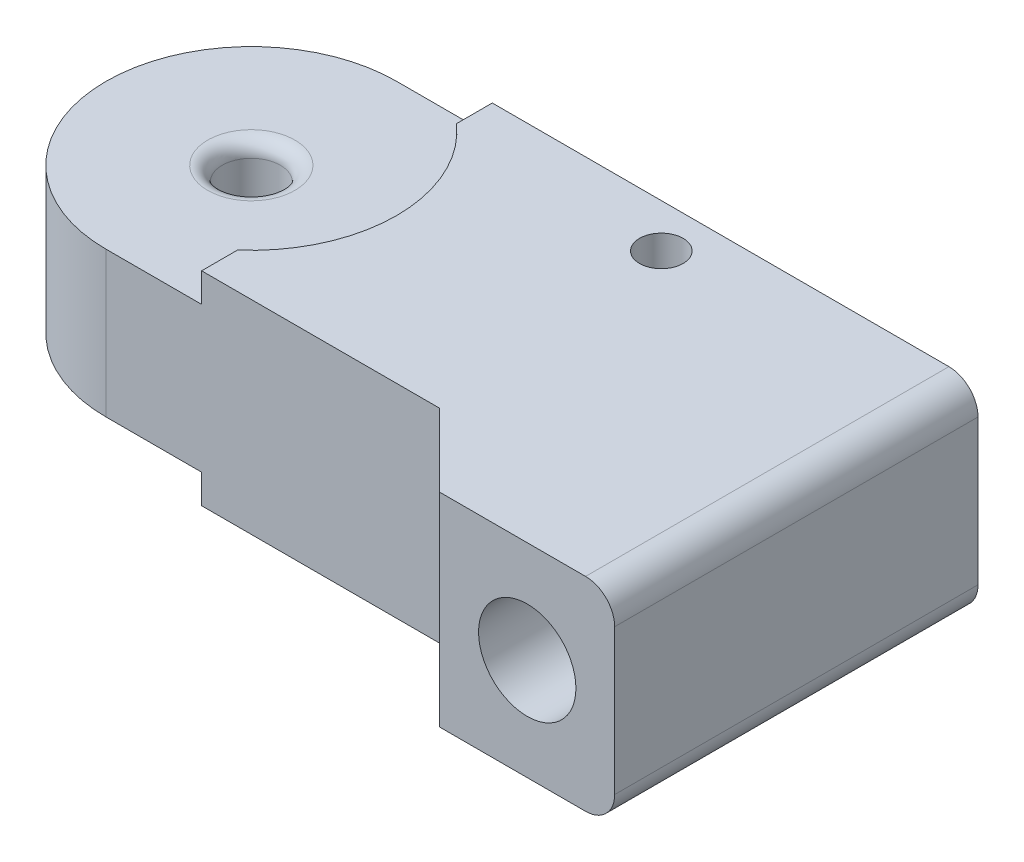
ISO-10303-21;
HEADER;
FILE_DESCRIPTION(('STEP AP214'),'2;1');
FILE_NAME('part.step','',(''),(''),'','','');
FILE_SCHEMA(('AUTOMOTIVE_DESIGN { 1 0 10303 214 1 1 1 1 }'));
ENDSEC;
DATA;
#1=APPLICATION_CONTEXT('core data for automotive mechanical design processes');
#2=APPLICATION_PROTOCOL_DEFINITION('international standard','automotive_design',2000,#1);
#3=PRODUCT_CONTEXT('',#1,'mechanical');
#4=PRODUCT('Part','Part','',(#3));
#5=PRODUCT_RELATED_PRODUCT_CATEGORY('part','',(#4));
#6=PRODUCT_DEFINITION_FORMATION('','',#4);
#7=PRODUCT_DEFINITION_CONTEXT('part definition',#1,'design');
#8=PRODUCT_DEFINITION('design','',#6,#7);
#9=PRODUCT_DEFINITION_SHAPE('','',#8);
#10=(LENGTH_UNIT() NAMED_UNIT(*) SI_UNIT(.MILLI.,.METRE.));
#11=(NAMED_UNIT(*) PLANE_ANGLE_UNIT() SI_UNIT($,.RADIAN.));
#12=(NAMED_UNIT(*) SI_UNIT($,.STERADIAN.) SOLID_ANGLE_UNIT());
#13=UNCERTAINTY_MEASURE_WITH_UNIT(LENGTH_MEASURE(1.E-05),#10,'distance_accuracy_value','');
#14=(GEOMETRIC_REPRESENTATION_CONTEXT(3) GLOBAL_UNCERTAINTY_ASSIGNED_CONTEXT((#13)) GLOBAL_UNIT_ASSIGNED_CONTEXT((#10,
#11,#12)) REPRESENTATION_CONTEXT('',''));
#15=CARTESIAN_POINT('',(0.,0.,0.));
#16=DIRECTION('',(0.,0.,1.));
#17=DIRECTION('',(1.,0.,0.));
#18=AXIS2_PLACEMENT_3D('',#15,#16,#17);
#19=CARTESIAN_POINT('',(25.,10.,10.));
#20=DIRECTION('',(0.,0.,-1.));
#21=DIRECTION('',(-1.,0.,0.));
#22=AXIS2_PLACEMENT_3D('',#19,#20,#21);
#23=PLANE('',#22);
#24=DIRECTION('',(1.,0.,0.));
#25=VECTOR('',#24,1.);
#26=CARTESIAN_POINT('',(25.,-2.,10.));
#27=LINE('',#26,#25);
#28=CARTESIAN_POINT('',(-8.42023376202405,-2.,10.));
#29=VERTEX_POINT('',#28);
#30=CARTESIAN_POINT('',(7.96424775126987,-2.,10.));
#31=VERTEX_POINT('',#30);
#32=EDGE_CURVE('E201',#29,#31,#27,.T.);
#33=ORIENTED_EDGE('',*,*,#32,.T.);
#34=DIRECTION('',(0.,1.,0.));
#35=VECTOR('',#34,1.);
#36=CARTESIAN_POINT('',(7.96424775126987,12.,10.));
#37=LINE('',#36,#35);
#38=CARTESIAN_POINT('',(7.96424775126987,12.,10.));
#39=VERTEX_POINT('',#38);
#40=EDGE_CURVE('E58',#31,#39,#37,.T.);
#41=ORIENTED_EDGE('',*,*,#40,.T.);
#42=DIRECTION('',(1.,0.,0.));
#43=VECTOR('',#42,1.);
#44=CARTESIAN_POINT('',(25.,12.,10.));
#45=LINE('',#44,#43);
#46=CARTESIAN_POINT('',(-8.42023376202405,12.,10.));
#47=VERTEX_POINT('',#46);
#48=EDGE_CURVE('E241',#47,#39,#45,.T.);
#49=ORIENTED_EDGE('',*,*,#48,.F.);
#50=DIRECTION('',(0.,-1.,0.));
#51=VECTOR('',#50,1.);
#52=CARTESIAN_POINT('',(-8.42023376202405,12.,10.));
#53=LINE('',#52,#51);
#54=CARTESIAN_POINT('',(-8.42023376202405,10.,10.));
#55=VERTEX_POINT('',#54);
#56=EDGE_CURVE('E243',#47,#55,#53,.T.);
#57=ORIENTED_EDGE('',*,*,#56,.T.);
#58=DIRECTION('',(1.,0.,0.));
#59=VECTOR('',#58,1.);
#60=CARTESIAN_POINT('',(25.,10.,10.));
#61=LINE('',#60,#59);
#62=CARTESIAN_POINT('',(-15.,10.,10.));
#63=VERTEX_POINT('',#62);
#64=EDGE_CURVE('E266',#63,#55,#61,.T.);
#65=ORIENTED_EDGE('',*,*,#64,.F.);
#66=DIRECTION('',(0.,-1.,0.));
#67=VECTOR('',#66,1.);
#68=CARTESIAN_POINT('',(-15.,10.,10.));
#69=LINE('',#68,#67);
#70=CARTESIAN_POINT('',(-15.,0.,10.));
#71=VERTEX_POINT('',#70);
#72=EDGE_CURVE('E277',#63,#71,#69,.T.);
#73=ORIENTED_EDGE('',*,*,#72,.T.);
#74=DIRECTION('',(1.,0.,0.));
#75=VECTOR('',#74,1.);
#76=CARTESIAN_POINT('',(25.,0.,10.));
#77=LINE('',#76,#75);
#78=CARTESIAN_POINT('',(-8.42023376202405,0.,10.));
#79=VERTEX_POINT('',#78);
#80=EDGE_CURVE('E272',#71,#79,#77,.T.);
#81=ORIENTED_EDGE('',*,*,#80,.T.);
#82=DIRECTION('',(0.,1.,0.));
#83=VECTOR('',#82,1.);
#84=CARTESIAN_POINT('',(-8.42023376202405,-2.,10.));
#85=LINE('',#84,#83);
#86=EDGE_CURVE('E226',#29,#79,#85,.T.);
#87=ORIENTED_EDGE('',*,*,#86,.F.);
#88=EDGE_LOOP('',(#33,#41,#49,#57,#65,#73,#81,#87));
#89=FACE_BOUND('',#88,.T.);
#90=ADVANCED_FACE('F36',(#89),#23,.F.);
#91=CARTESIAN_POINT('',(25.,10.,10.));
#92=DIRECTION('',(-1.,0.,0.));
#93=DIRECTION('',(0.,0.,1.));
#94=AXIS2_PLACEMENT_3D('',#91,#92,#93);
#95=PLANE('',#94);
#96=DIRECTION('',(0.,0.,-1.));
#97=VECTOR('',#96,1.);
#98=CARTESIAN_POINT('',(25.,10.,10.));
#99=LINE('',#98,#97);
#100=CARTESIAN_POINT('',(25.,10.,-10.));
#101=VERTEX_POINT('',#100);
#102=CARTESIAN_POINT('',(25.,10.,15.));
#103=VERTEX_POINT('',#102);
#104=EDGE_CURVE('E167',#101,#103,#99,.F.);
#105=ORIENTED_EDGE('',*,*,#104,.T.);
#106=DIRECTION('',(0.,1.,0.));
#107=VECTOR('',#106,1.);
#108=CARTESIAN_POINT('',(25.,0.,15.));
#109=LINE('',#108,#107);
#110=CARTESIAN_POINT('',(25.,0.,15.));
#111=VERTEX_POINT('',#110);
#112=EDGE_CURVE('E170',#111,#103,#109,.T.);
#113=ORIENTED_EDGE('',*,*,#112,.F.);
#114=DIRECTION('',(0.,0.,-1.));
#115=VECTOR('',#114,1.);
#116=CARTESIAN_POINT('',(25.,0.,-10.));
#117=LINE('',#116,#115);
#118=CARTESIAN_POINT('',(25.,0.,-10.));
#119=VERTEX_POINT('',#118);
#120=EDGE_CURVE('E156',#111,#119,#117,.T.);
#121=ORIENTED_EDGE('',*,*,#120,.T.);
#122=DIRECTION('',(0.,-1.,0.));
#123=VECTOR('',#122,1.);
#124=CARTESIAN_POINT('',(25.,10.,-10.));
#125=LINE('',#124,#123);
#126=EDGE_CURVE('E271',#101,#119,#125,.T.);
#127=ORIENTED_EDGE('',*,*,#126,.F.);
#128=EDGE_LOOP('',(#105,#113,#121,#127));
#129=FACE_BOUND('',#128,.T.);
#130=ADVANCED_FACE('F171',(#129),#95,.F.);
#131=CARTESIAN_POINT('',(25.,10.,-10.));
#132=DIRECTION('',(0.,0.,1.));
#133=DIRECTION('',(1.,0.,0.));
#134=AXIS2_PLACEMENT_3D('',#131,#132,#133);
#135=PLANE('',#134);
#136=CARTESIAN_POINT('',(18.9842477512698,5.,-10.));
#137=DIRECTION('',(0.,0.,-1.));
#138=DIRECTION('',(-1.,0.,0.));
#139=AXIS2_PLACEMENT_3D('',#136,#137,#138);
#140=CIRCLE('',#139,3.35);
#141=CARTESIAN_POINT('',(15.6342477512698,5.,-10.));
#142=VERTEX_POINT('',#141);
#143=EDGE_CURVE('E262',#142,#142,#140,.T.);
#144=ORIENTED_EDGE('',*,*,#143,.F.);
#145=EDGE_LOOP('',(#144));
#146=FACE_BOUND('',#145,.T.);
#147=ORIENTED_EDGE('',*,*,#126,.T.);
#148=CARTESIAN_POINT('',(23.,0.,-10.));
#149=DIRECTION('',(0.,0.,1.));
#150=DIRECTION('',(1.,0.,0.));
#151=AXIS2_PLACEMENT_3D('',#148,#149,#150);
#152=CIRCLE('',#151,2.);
#153=CARTESIAN_POINT('',(23.,-2.,-10.));
#154=VERTEX_POINT('',#153);
#155=EDGE_CURVE('E162',#119,#154,#152,.F.);
#156=ORIENTED_EDGE('',*,*,#155,.T.);
#157=DIRECTION('',(-1.,0.,0.));
#158=VECTOR('',#157,1.);
#159=CARTESIAN_POINT('',(25.,-2.,-10.));
#160=LINE('',#159,#158);
#161=CARTESIAN_POINT('',(-8.42023376202405,-2.,-10.));
#162=VERTEX_POINT('',#161);
#163=EDGE_CURVE('E199',#154,#162,#160,.T.);
#164=ORIENTED_EDGE('',*,*,#163,.T.);
#165=DIRECTION('',(0.,1.,0.));
#166=VECTOR('',#165,1.);
#167=CARTESIAN_POINT('',(-8.42023376202405,-2.,-10.));
#168=LINE('',#167,#166);
#169=CARTESIAN_POINT('',(-8.42023376202405,0.,-10.));
#170=VERTEX_POINT('',#169);
#171=EDGE_CURVE('E213',#162,#170,#168,.T.);
#172=ORIENTED_EDGE('',*,*,#171,.T.);
#173=DIRECTION('',(-1.,0.,0.));
#174=VECTOR('',#173,1.);
#175=CARTESIAN_POINT('',(25.,0.,-10.));
#176=LINE('',#175,#174);
#177=CARTESIAN_POINT('',(-15.,0.,-10.));
#178=VERTEX_POINT('',#177);
#179=EDGE_CURVE('E269',#170,#178,#176,.T.);
#180=ORIENTED_EDGE('',*,*,#179,.T.);
#181=DIRECTION('',(0.,-1.,0.));
#182=VECTOR('',#181,1.);
#183=CARTESIAN_POINT('',(-15.,10.,-10.));
#184=LINE('',#183,#182);
#185=CARTESIAN_POINT('',(-15.,10.,-10.));
#186=VERTEX_POINT('',#185);
#187=EDGE_CURVE('E289',#178,#186,#184,.F.);
#188=ORIENTED_EDGE('',*,*,#187,.T.);
#189=DIRECTION('',(-1.,0.,0.));
#190=VECTOR('',#189,1.);
#191=CARTESIAN_POINT('',(25.,10.,-10.));
#192=LINE('',#191,#190);
#193=CARTESIAN_POINT('',(-8.42023376202405,10.,-10.));
#194=VERTEX_POINT('',#193);
#195=EDGE_CURVE('E268',#194,#186,#192,.T.);
#196=ORIENTED_EDGE('',*,*,#195,.F.);
#197=DIRECTION('',(0.,-1.,0.));
#198=VECTOR('',#197,1.);
#199=CARTESIAN_POINT('',(-8.42023376202405,12.,-10.));
#200=LINE('',#199,#198);
#201=CARTESIAN_POINT('',(-8.42023376202405,12.,-10.));
#202=VERTEX_POINT('',#201);
#203=EDGE_CURVE('E259',#202,#194,#200,.T.);
#204=ORIENTED_EDGE('',*,*,#203,.F.);
#205=DIRECTION('',(-1.,0.,0.));
#206=VECTOR('',#205,1.);
#207=CARTESIAN_POINT('',(25.,12.,-10.));
#208=LINE('',#207,#206);
#209=CARTESIAN_POINT('',(23.,12.,-10.));
#210=VERTEX_POINT('',#209);
#211=EDGE_CURVE('E232',#210,#202,#208,.T.);
#212=ORIENTED_EDGE('',*,*,#211,.F.);
#213=CARTESIAN_POINT('',(23.,10.,-10.));
#214=DIRECTION('',(0.,0.,1.));
#215=DIRECTION('',(1.,0.,0.));
#216=AXIS2_PLACEMENT_3D('',#213,#214,#215);
#217=CIRCLE('',#216,2.);
#218=EDGE_CURVE('E166',#210,#101,#217,.F.);
#219=ORIENTED_EDGE('',*,*,#218,.T.);
#220=EDGE_LOOP('',(#147,#156,#164,#172,#180,#188,#196,#204,#212,#219));
#221=FACE_BOUND('',#220,.T.);
#222=ADVANCED_FACE('F337',(#146,#221),#135,.F.);
#223=CARTESIAN_POINT('',(0.,10.,0.));
#224=DIRECTION('',(0.,1.,0.));
#225=DIRECTION('',(0.,0.,1.));
#226=AXIS2_PLACEMENT_3D('',#223,#224,#225);
#227=PLANE('',#226);
#228=CARTESIAN_POINT('',(-15.,10.,0.));
#229=DIRECTION('',(0.,1.,0.));
#230=DIRECTION('',(0.,0.,1.));
#231=AXIS2_PLACEMENT_3D('',#228,#229,#230);
#232=CIRCLE('',#231,3.);
#233=CARTESIAN_POINT('',(-15.,10.,3.));
#234=VERTEX_POINT('',#233);
#235=EDGE_CURVE('E308',#234,#234,#232,.F.);
#236=ORIENTED_EDGE('',*,*,#235,.T.);
#237=EDGE_LOOP('',(#236));
#238=FACE_BOUND('',#237,.T.);
#239=DIRECTION('',(0.,0.,1.));
#240=VECTOR('',#239,1.);
#241=CARTESIAN_POINT('',(-8.42023376202405,10.,7.53038353960751));
#242=LINE('',#241,#240);
#243=CARTESIAN_POINT('',(-8.42023376202405,10.,7.53038353960751));
#244=VERTEX_POINT('',#243);
#245=EDGE_CURVE('E235',#244,#55,#242,.T.);
#246=ORIENTED_EDGE('',*,*,#245,.F.);
#247=CARTESIAN_POINT('',(-15.,10.,0.));
#248=DIRECTION('',(0.,-1.,0.));
#249=DIRECTION('',(0.,0.,1.));
#250=AXIS2_PLACEMENT_3D('',#247,#248,#249);
#251=CIRCLE('',#250,10.);
#252=CARTESIAN_POINT('',(-8.42023376202405,10.,-7.53038353960751));
#253=VERTEX_POINT('',#252);
#254=EDGE_CURVE('E246',#253,#244,#251,.T.);
#255=ORIENTED_EDGE('',*,*,#254,.F.);
#256=DIRECTION('',(0.,0.,1.));
#257=VECTOR('',#256,1.);
#258=CARTESIAN_POINT('',(-8.42023376202405,10.,-10.));
#259=LINE('',#258,#257);
#260=EDGE_CURVE('E231',#194,#253,#259,.T.);
#261=ORIENTED_EDGE('',*,*,#260,.F.);
#262=ORIENTED_EDGE('',*,*,#195,.T.);
#263=CARTESIAN_POINT('',(-15.,10.,0.));
#264=DIRECTION('',(0.,1.,0.));
#265=DIRECTION('',(0.,0.,1.));
#266=AXIS2_PLACEMENT_3D('',#263,#264,#265);
#267=CIRCLE('',#266,10.);
#268=CARTESIAN_POINT('',(-25.,10.,0.));
#269=VERTEX_POINT('',#268);
#270=EDGE_CURVE('E285',#186,#269,#267,.T.);
#271=ORIENTED_EDGE('',*,*,#270,.T.);
#272=CARTESIAN_POINT('',(-15.,10.,0.));
#273=DIRECTION('',(0.,1.,0.));
#274=DIRECTION('',(0.,0.,1.));
#275=AXIS2_PLACEMENT_3D('',#272,#273,#274);
#276=CIRCLE('',#275,10.);
#277=EDGE_CURVE('E287',#269,#63,#276,.T.);
#278=ORIENTED_EDGE('',*,*,#277,.T.);
#279=ORIENTED_EDGE('',*,*,#64,.T.);
#280=EDGE_LOOP('',(#246,#255,#261,#262,#271,#278,#279));
#281=FACE_BOUND('',#280,.T.);
#282=ADVANCED_FACE('F383',(#238,#281),#227,.T.);
#283=CARTESIAN_POINT('',(0.,0.,0.));
#284=DIRECTION('',(0.,1.,0.));
#285=DIRECTION('',(0.,0.,1.));
#286=AXIS2_PLACEMENT_3D('',#283,#284,#285);
#287=PLANE('',#286);
#288=CARTESIAN_POINT('',(-15.,0.,0.));
#289=DIRECTION('',(0.,1.,0.));
#290=DIRECTION('',(0.,0.,1.));
#291=AXIS2_PLACEMENT_3D('',#288,#289,#290);
#292=CIRCLE('',#291,3.);
#293=CARTESIAN_POINT('',(-15.,0.,3.));
#294=VERTEX_POINT('',#293);
#295=EDGE_CURVE('E311',#294,#294,#292,.T.);
#296=ORIENTED_EDGE('',*,*,#295,.T.);
#297=EDGE_LOOP('',(#296));
#298=FACE_BOUND('',#297,.T.);
#299=ORIENTED_EDGE('',*,*,#179,.F.);
#300=DIRECTION('',(0.,0.,1.));
#301=VECTOR('',#300,1.);
#302=CARTESIAN_POINT('',(-8.42023376202405,0.,-10.));
#303=LINE('',#302,#301);
#304=CARTESIAN_POINT('',(-8.42023376202405,0.,-7.53038353960751));
#305=VERTEX_POINT('',#304);
#306=EDGE_CURVE('E202',#170,#305,#303,.T.);
#307=ORIENTED_EDGE('',*,*,#306,.T.);
#308=CARTESIAN_POINT('',(-15.,0.,0.));
#309=DIRECTION('',(0.,-1.,0.));
#310=DIRECTION('',(0.,0.,1.));
#311=AXIS2_PLACEMENT_3D('',#308,#309,#310);
#312=CIRCLE('',#311,10.);
#313=CARTESIAN_POINT('',(-8.42023376202405,0.,7.53038353960751));
#314=VERTEX_POINT('',#313);
#315=EDGE_CURVE('E216',#305,#314,#312,.T.);
#316=ORIENTED_EDGE('',*,*,#315,.T.);
#317=DIRECTION('',(0.,0.,1.));
#318=VECTOR('',#317,1.);
#319=CARTESIAN_POINT('',(-8.42023376202405,0.,7.53038353960751));
#320=LINE('',#319,#318);
#321=EDGE_CURVE('E198',#314,#79,#320,.T.);
#322=ORIENTED_EDGE('',*,*,#321,.T.);
#323=ORIENTED_EDGE('',*,*,#80,.F.);
#324=CARTESIAN_POINT('',(-15.,0.,0.));
#325=DIRECTION('',(0.,1.,0.));
#326=DIRECTION('',(0.,0.,1.));
#327=AXIS2_PLACEMENT_3D('',#324,#325,#326);
#328=CIRCLE('',#327,10.);
#329=CARTESIAN_POINT('',(-25.,0.,0.));
#330=VERTEX_POINT('',#329);
#331=EDGE_CURVE('E283',#71,#330,#328,.F.);
#332=ORIENTED_EDGE('',*,*,#331,.T.);
#333=CARTESIAN_POINT('',(-15.,0.,0.));
#334=DIRECTION('',(0.,1.,0.));
#335=DIRECTION('',(0.,0.,1.));
#336=AXIS2_PLACEMENT_3D('',#333,#334,#335);
#337=CIRCLE('',#336,10.);
#338=EDGE_CURVE('E280',#330,#178,#337,.F.);
#339=ORIENTED_EDGE('',*,*,#338,.T.);
#340=EDGE_LOOP('',(#299,#307,#316,#322,#323,#332,#339));
#341=FACE_BOUND('',#340,.T.);
#342=ADVANCED_FACE('F316',(#298,#341),#287,.F.);
#343=CARTESIAN_POINT('',(-15.,10.,0.));
#344=DIRECTION('',(0.,-1.,0.));
#345=DIRECTION('',(0.,0.,-1.));
#346=AXIS2_PLACEMENT_3D('',#343,#344,#345);
#347=CYLINDRICAL_SURFACE('',#346,10.);
#348=DIRECTION('',(0.,-1.,0.));
#349=VECTOR('',#348,1.);
#350=CARTESIAN_POINT('',(-25.,10.,0.));
#351=LINE('',#350,#349);
#352=EDGE_CURVE('E265',#269,#330,#351,.T.);
#353=ORIENTED_EDGE('',*,*,#352,.F.);
#354=ORIENTED_EDGE('',*,*,#270,.F.);
#355=ORIENTED_EDGE('',*,*,#187,.F.);
#356=ORIENTED_EDGE('',*,*,#338,.F.);
#357=EDGE_LOOP('',(#353,#354,#355,#356));
#358=FACE_BOUND('',#357,.T.);
#359=ADVANCED_FACE('F345',(#358),#347,.T.);
#360=CARTESIAN_POINT('',(-15.,10.,0.));
#361=DIRECTION('',(0.,-1.,0.));
#362=DIRECTION('',(0.,0.,-1.));
#363=AXIS2_PLACEMENT_3D('',#360,#361,#362);
#364=CYLINDRICAL_SURFACE('',#363,10.);
#365=ORIENTED_EDGE('',*,*,#277,.F.);
#366=ORIENTED_EDGE('',*,*,#352,.T.);
#367=ORIENTED_EDGE('',*,*,#331,.F.);
#368=ORIENTED_EDGE('',*,*,#72,.F.);
#369=EDGE_LOOP('',(#365,#366,#367,#368));
#370=FACE_BOUND('',#369,.T.);
#371=ADVANCED_FACE('F341',(#370),#364,.T.);
#372=CARTESIAN_POINT('',(-15.,0.,0.));
#373=DIRECTION('',(0.,1.,0.));
#374=DIRECTION('',(0.,0.,1.));
#375=AXIS2_PLACEMENT_3D('',#372,#373,#374);
#376=CYLINDRICAL_SURFACE('',#375,2.);
#377=CARTESIAN_POINT('',(-15.,9.,0.));
#378=DIRECTION('',(0.,1.,0.));
#379=DIRECTION('',(0.,0.,1.));
#380=AXIS2_PLACEMENT_3D('',#377,#378,#379);
#381=CIRCLE('',#380,2.);
#382=CARTESIAN_POINT('',(-15.,9.,2.));
#383=VERTEX_POINT('',#382);
#384=EDGE_CURVE('E305',#383,#383,#381,.T.);
#385=ORIENTED_EDGE('',*,*,#384,.T.);
#386=EDGE_LOOP('',(#385));
#387=FACE_BOUND('',#386,.T.);
#388=CARTESIAN_POINT('',(-15.,1.,0.));
#389=DIRECTION('',(0.,1.,0.));
#390=DIRECTION('',(0.,0.,1.));
#391=AXIS2_PLACEMENT_3D('',#388,#389,#390);
#392=CIRCLE('',#391,2.);
#393=CARTESIAN_POINT('',(-15.,1.,2.));
#394=VERTEX_POINT('',#393);
#395=EDGE_CURVE('E302',#394,#394,#392,.F.);
#396=ORIENTED_EDGE('',*,*,#395,.T.);
#397=EDGE_LOOP('',(#396));
#398=FACE_BOUND('',#397,.T.);
#399=ADVANCED_FACE('F344',(#387,#398),#376,.F.);
#400=CARTESIAN_POINT('',(18.9842477512698,5.,30.));
#401=DIRECTION('',(0.,0.,-1.));
#402=DIRECTION('',(-1.,0.,0.));
#403=AXIS2_PLACEMENT_3D('',#400,#401,#402);
#404=CYLINDRICAL_SURFACE('',#403,3.35);
#405=ORIENTED_EDGE('',*,*,#143,.T.);
#406=EDGE_LOOP('',(#405));
#407=FACE_BOUND('',#406,.T.);
#408=CARTESIAN_POINT('',(18.9842477512698,5.,15.));
#409=DIRECTION('',(0.,0.,1.));
#410=DIRECTION('',(1.,0.,0.));
#411=AXIS2_PLACEMENT_3D('',#408,#409,#410);
#412=CIRCLE('',#411,3.35);
#413=CARTESIAN_POINT('',(22.3342477512698,5.,15.));
#414=VERTEX_POINT('',#413);
#415=EDGE_CURVE('E183',#414,#414,#412,.T.);
#416=ORIENTED_EDGE('',*,*,#415,.T.);
#417=EDGE_LOOP('',(#416));
#418=FACE_BOUND('',#417,.T.);
#419=ADVANCED_FACE('F427',(#407,#418),#404,.F.);
#420=CARTESIAN_POINT('',(-8.42023376202405,12.,-10.));
#421=DIRECTION('',(1.,0.,0.));
#422=DIRECTION('',(0.,0.,-1.));
#423=AXIS2_PLACEMENT_3D('',#420,#421,#422);
#424=PLANE('',#423);
#425=ORIENTED_EDGE('',*,*,#260,.T.);
#426=DIRECTION('',(0.,-1.,0.));
#427=VECTOR('',#426,1.);
#428=CARTESIAN_POINT('',(-8.42023376202405,12.,-7.53038353960751));
#429=LINE('',#428,#427);
#430=CARTESIAN_POINT('',(-8.42023376202405,12.,-7.53038353960751));
#431=VERTEX_POINT('',#430);
#432=EDGE_CURVE('E256',#431,#253,#429,.T.);
#433=ORIENTED_EDGE('',*,*,#432,.F.);
#434=DIRECTION('',(0.,0.,1.));
#435=VECTOR('',#434,1.);
#436=CARTESIAN_POINT('',(-8.42023376202405,12.,-10.));
#437=LINE('',#436,#435);
#438=EDGE_CURVE('E234',#202,#431,#437,.T.);
#439=ORIENTED_EDGE('',*,*,#438,.F.);
#440=ORIENTED_EDGE('',*,*,#203,.T.);
#441=EDGE_LOOP('',(#425,#433,#439,#440));
#442=FACE_BOUND('',#441,.T.);
#443=ADVANCED_FACE('F387',(#442),#424,.F.);
#444=CARTESIAN_POINT('',(-15.,12.,0.));
#445=DIRECTION('',(0.,-1.,0.));
#446=DIRECTION('',(0.,0.,-1.));
#447=AXIS2_PLACEMENT_3D('',#444,#445,#446);
#448=CYLINDRICAL_SURFACE('',#447,10.);
#449=ORIENTED_EDGE('',*,*,#254,.T.);
#450=DIRECTION('',(0.,-1.,0.));
#451=VECTOR('',#450,1.);
#452=CARTESIAN_POINT('',(-8.42023376202405,12.,7.53038353960751));
#453=LINE('',#452,#451);
#454=CARTESIAN_POINT('',(-8.42023376202405,12.,7.53038353960751));
#455=VERTEX_POINT('',#454);
#456=EDGE_CURVE('E253',#455,#244,#453,.T.);
#457=ORIENTED_EDGE('',*,*,#456,.F.);
#458=CARTESIAN_POINT('',(-15.,12.,0.));
#459=DIRECTION('',(0.,-1.,0.));
#460=DIRECTION('',(0.,0.,1.));
#461=AXIS2_PLACEMENT_3D('',#458,#459,#460);
#462=CIRCLE('',#461,10.);
#463=EDGE_CURVE('E237',#431,#455,#462,.T.);
#464=ORIENTED_EDGE('',*,*,#463,.F.);
#465=ORIENTED_EDGE('',*,*,#432,.T.);
#466=EDGE_LOOP('',(#449,#457,#464,#465));
#467=FACE_BOUND('',#466,.T.);
#468=ADVANCED_FACE('F391',(#467),#448,.F.);
#469=CARTESIAN_POINT('',(-8.42023376202405,12.,7.53038353960751));
#470=DIRECTION('',(1.,0.,0.));
#471=DIRECTION('',(0.,0.,-1.));
#472=AXIS2_PLACEMENT_3D('',#469,#470,#471);
#473=PLANE('',#472);
#474=ORIENTED_EDGE('',*,*,#245,.T.);
#475=ORIENTED_EDGE('',*,*,#56,.F.);
#476=DIRECTION('',(0.,0.,1.));
#477=VECTOR('',#476,1.);
#478=CARTESIAN_POINT('',(-8.42023376202405,12.,7.53038353960751));
#479=LINE('',#478,#477);
#480=EDGE_CURVE('E239',#455,#47,#479,.T.);
#481=ORIENTED_EDGE('',*,*,#480,.F.);
#482=ORIENTED_EDGE('',*,*,#456,.T.);
#483=EDGE_LOOP('',(#474,#475,#481,#482));
#484=FACE_BOUND('',#483,.T.);
#485=ADVANCED_FACE('F396',(#484),#473,.F.);
#486=CARTESIAN_POINT('',(-15.,12.,0.));
#487=DIRECTION('',(0.,1.,0.));
#488=DIRECTION('',(0.,0.,1.));
#489=AXIS2_PLACEMENT_3D('',#486,#487,#488);
#490=PLANE('',#489);
#491=CARTESIAN_POINT('',(6.21016093417381,12.,-7.));
#492=DIRECTION('',(0.,1.,0.));
#493=DIRECTION('',(0.,0.,1.));
#494=AXIS2_PLACEMENT_3D('',#491,#492,#493);
#495=CIRCLE('',#494,1.5);
#496=CARTESIAN_POINT('',(6.21016093417381,12.,-5.5));
#497=VERTEX_POINT('',#496);
#498=EDGE_CURVE('E228',#497,#497,#495,.T.);
#499=ORIENTED_EDGE('',*,*,#498,.F.);
#500=EDGE_LOOP('',(#499));
#501=FACE_BOUND('',#500,.T.);
#502=ORIENTED_EDGE('',*,*,#48,.T.);
#503=DIRECTION('',(-0.707106781186545,0.,-0.70710678118655));
#504=VECTOR('',#503,1.);
#505=CARTESIAN_POINT('',(12.9642477512698,12.,15.));
#506=LINE('',#505,#504);
#507=CARTESIAN_POINT('',(12.9642477512698,12.,15.));
#508=VERTEX_POINT('',#507);
#509=EDGE_CURVE('E11',#39,#508,#506,.F.);
#510=ORIENTED_EDGE('',*,*,#509,.T.);
#511=DIRECTION('',(-1.,0.,0.));
#512=VECTOR('',#511,1.);
#513=CARTESIAN_POINT('',(23.,12.,15.));
#514=LINE('',#513,#512);
#515=CARTESIAN_POINT('',(23.,12.,15.));
#516=VERTEX_POINT('',#515);
#517=EDGE_CURVE('E189',#516,#508,#514,.T.);
#518=ORIENTED_EDGE('',*,*,#517,.F.);
#519=DIRECTION('',(0.,0.,-1.));
#520=VECTOR('',#519,1.);
#521=CARTESIAN_POINT('',(23.,12.,-10.));
#522=LINE('',#521,#520);
#523=EDGE_CURVE('E299',#516,#210,#522,.T.);
#524=ORIENTED_EDGE('',*,*,#523,.T.);
#525=ORIENTED_EDGE('',*,*,#211,.T.);
#526=ORIENTED_EDGE('',*,*,#438,.T.);
#527=ORIENTED_EDGE('',*,*,#463,.T.);
#528=ORIENTED_EDGE('',*,*,#480,.T.);
#529=EDGE_LOOP('',(#502,#510,#518,#524,#525,#526,#527,#528));
#530=FACE_BOUND('',#529,.T.);
#531=ADVANCED_FACE('F361',(#501,#530),#490,.T.);
#532=CARTESIAN_POINT('',(6.21016093417381,-8.,-7.));
#533=DIRECTION('',(0.,1.,0.));
#534=DIRECTION('',(0.,0.,1.));
#535=AXIS2_PLACEMENT_3D('',#532,#533,#534);
#536=CYLINDRICAL_SURFACE('',#535,1.5);
#537=ORIENTED_EDGE('',*,*,#498,.T.);
#538=EDGE_LOOP('',(#537));
#539=FACE_BOUND('',#538,.T.);
#540=CARTESIAN_POINT('',(6.21016093417381,-2.,-7.));
#541=DIRECTION('',(0.,1.,0.));
#542=DIRECTION('',(0.,0.,1.));
#543=AXIS2_PLACEMENT_3D('',#540,#541,#542);
#544=CIRCLE('',#543,1.5);
#545=CARTESIAN_POINT('',(6.21016093417381,-2.,-5.5));
#546=VERTEX_POINT('',#545);
#547=EDGE_CURVE('E195',#546,#546,#544,.T.);
#548=ORIENTED_EDGE('',*,*,#547,.F.);
#549=EDGE_LOOP('',(#548));
#550=FACE_BOUND('',#549,.T.);
#551=ADVANCED_FACE('F414',(#539,#550),#536,.F.);
#552=CARTESIAN_POINT('',(-15.,-2.,0.));
#553=DIRECTION('',(0.,-1.,0.));
#554=DIRECTION('',(0.,0.,1.));
#555=AXIS2_PLACEMENT_3D('',#552,#553,#554);
#556=PLANE('',#555);
#557=ORIENTED_EDGE('',*,*,#547,.T.);
#558=EDGE_LOOP('',(#557));
#559=FACE_BOUND('',#558,.T.);
#560=ORIENTED_EDGE('',*,*,#163,.F.);
#561=DIRECTION('',(0.,0.,-1.));
#562=VECTOR('',#561,1.);
#563=CARTESIAN_POINT('',(23.,-2.,10.));
#564=LINE('',#563,#562);
#565=CARTESIAN_POINT('',(23.,-2.,15.));
#566=VERTEX_POINT('',#565);
#567=EDGE_CURVE('E297',#154,#566,#564,.F.);
#568=ORIENTED_EDGE('',*,*,#567,.T.);
#569=DIRECTION('',(1.,0.,0.));
#570=VECTOR('',#569,1.);
#571=CARTESIAN_POINT('',(12.9642477512698,-2.,15.));
#572=LINE('',#571,#570);
#573=CARTESIAN_POINT('',(12.9642477512698,-2.,15.));
#574=VERTEX_POINT('',#573);
#575=EDGE_CURVE('E182',#574,#566,#572,.T.);
#576=ORIENTED_EDGE('',*,*,#575,.F.);
#577=DIRECTION('',(0.707106781186545,0.,0.70710678118655));
#578=VECTOR('',#577,1.);
#579=CARTESIAN_POINT('',(12.9642477512698,-2.,15.));
#580=LINE('',#579,#578);
#581=EDGE_CURVE('E45',#574,#31,#580,.F.);
#582=ORIENTED_EDGE('',*,*,#581,.T.);
#583=ORIENTED_EDGE('',*,*,#32,.F.);
#584=DIRECTION('',(0.,0.,1.));
#585=VECTOR('',#584,1.);
#586=CARTESIAN_POINT('',(-8.42023376202405,-2.,7.53038353960751));
#587=LINE('',#586,#585);
#588=CARTESIAN_POINT('',(-8.42023376202405,-2.,7.53038353960751));
#589=VERTEX_POINT('',#588);
#590=EDGE_CURVE('E204',#589,#29,#587,.T.);
#591=ORIENTED_EDGE('',*,*,#590,.F.);
#592=CARTESIAN_POINT('',(-15.,-2.,0.));
#593=DIRECTION('',(0.,-1.,0.));
#594=DIRECTION('',(0.,0.,1.));
#595=AXIS2_PLACEMENT_3D('',#592,#593,#594);
#596=CIRCLE('',#595,10.);
#597=CARTESIAN_POINT('',(-8.42023376202405,-2.,-7.53038353960751));
#598=VERTEX_POINT('',#597);
#599=EDGE_CURVE('E207',#598,#589,#596,.T.);
#600=ORIENTED_EDGE('',*,*,#599,.F.);
#601=DIRECTION('',(0.,0.,1.));
#602=VECTOR('',#601,1.);
#603=CARTESIAN_POINT('',(-8.42023376202405,-2.,-10.));
#604=LINE('',#603,#602);
#605=EDGE_CURVE('E210',#162,#598,#604,.T.);
#606=ORIENTED_EDGE('',*,*,#605,.F.);
#607=EDGE_LOOP('',(#560,#568,#576,#582,#583,#591,#600,#606));
#608=FACE_BOUND('',#607,.T.);
#609=ADVANCED_FACE('F365',(#559,#608),#556,.T.);
#610=CARTESIAN_POINT('',(-8.42023376202405,-2.,-10.));
#611=DIRECTION('',(-1.,0.,0.));
#612=DIRECTION('',(0.,0.,1.));
#613=AXIS2_PLACEMENT_3D('',#610,#611,#612);
#614=PLANE('',#613);
#615=ORIENTED_EDGE('',*,*,#306,.F.);
#616=ORIENTED_EDGE('',*,*,#171,.F.);
#617=ORIENTED_EDGE('',*,*,#605,.T.);
#618=DIRECTION('',(0.,1.,0.));
#619=VECTOR('',#618,1.);
#620=CARTESIAN_POINT('',(-8.42023376202405,-2.,-7.53038353960751));
#621=LINE('',#620,#619);
#622=EDGE_CURVE('E222',#598,#305,#621,.T.);
#623=ORIENTED_EDGE('',*,*,#622,.T.);
#624=EDGE_LOOP('',(#615,#616,#617,#623));
#625=FACE_BOUND('',#624,.T.);
#626=ADVANCED_FACE('F372',(#625),#614,.T.);
#627=CARTESIAN_POINT('',(-15.,-2.,0.));
#628=DIRECTION('',(0.,1.,0.));
#629=DIRECTION('',(0.,0.,1.));
#630=AXIS2_PLACEMENT_3D('',#627,#628,#629);
#631=CYLINDRICAL_SURFACE('',#630,10.);
#632=ORIENTED_EDGE('',*,*,#315,.F.);
#633=ORIENTED_EDGE('',*,*,#622,.F.);
#634=ORIENTED_EDGE('',*,*,#599,.T.);
#635=DIRECTION('',(0.,1.,0.));
#636=VECTOR('',#635,1.);
#637=CARTESIAN_POINT('',(-8.42023376202405,-2.,7.53038353960751));
#638=LINE('',#637,#636);
#639=EDGE_CURVE('E224',#589,#314,#638,.T.);
#640=ORIENTED_EDGE('',*,*,#639,.T.);
#641=EDGE_LOOP('',(#632,#633,#634,#640));
#642=FACE_BOUND('',#641,.T.);
#643=ADVANCED_FACE('F403',(#642),#631,.F.);
#644=CARTESIAN_POINT('',(-8.42023376202405,-2.,7.53038353960751));
#645=DIRECTION('',(-1.,0.,0.));
#646=DIRECTION('',(0.,0.,1.));
#647=AXIS2_PLACEMENT_3D('',#644,#645,#646);
#648=PLANE('',#647);
#649=ORIENTED_EDGE('',*,*,#321,.F.);
#650=ORIENTED_EDGE('',*,*,#639,.F.);
#651=ORIENTED_EDGE('',*,*,#590,.T.);
#652=ORIENTED_EDGE('',*,*,#86,.T.);
#653=EDGE_LOOP('',(#649,#650,#651,#652));
#654=FACE_BOUND('',#653,.T.);
#655=ADVANCED_FACE('F352',(#654),#648,.T.);
#656=CARTESIAN_POINT('',(23.,0.,10.));
#657=DIRECTION('',(0.,0.,1.));
#658=DIRECTION('',(1.,0.,0.));
#659=AXIS2_PLACEMENT_3D('',#656,#657,#658);
#660=CYLINDRICAL_SURFACE('',#659,2.);
#661=ORIENTED_EDGE('',*,*,#120,.F.);
#662=CARTESIAN_POINT('',(23.,0.,15.));
#663=DIRECTION('',(0.,0.,1.));
#664=DIRECTION('',(1.,0.,0.));
#665=AXIS2_PLACEMENT_3D('',#662,#663,#664);
#666=CIRCLE('',#665,2.);
#667=EDGE_CURVE('E161',#566,#111,#666,.T.);
#668=ORIENTED_EDGE('',*,*,#667,.F.);
#669=ORIENTED_EDGE('',*,*,#567,.F.);
#670=ORIENTED_EDGE('',*,*,#155,.F.);
#671=EDGE_LOOP('',(#661,#668,#669,#670));
#672=FACE_BOUND('',#671,.T.);
#673=ADVANCED_FACE('F158',(#672),#660,.T.);
#674=CARTESIAN_POINT('',(23.,10.,0.));
#675=DIRECTION('',(0.,0.,1.));
#676=DIRECTION('',(1.,0.,0.));
#677=AXIS2_PLACEMENT_3D('',#674,#675,#676);
#678=CYLINDRICAL_SURFACE('',#677,2.);
#679=ORIENTED_EDGE('',*,*,#523,.F.);
#680=CARTESIAN_POINT('',(23.,10.,15.));
#681=DIRECTION('',(0.,0.,1.));
#682=DIRECTION('',(1.,0.,0.));
#683=AXIS2_PLACEMENT_3D('',#680,#681,#682);
#684=CIRCLE('',#683,2.);
#685=EDGE_CURVE('E176',#103,#516,#684,.T.);
#686=ORIENTED_EDGE('',*,*,#685,.F.);
#687=ORIENTED_EDGE('',*,*,#104,.F.);
#688=ORIENTED_EDGE('',*,*,#218,.F.);
#689=EDGE_LOOP('',(#679,#686,#687,#688));
#690=FACE_BOUND('',#689,.T.);
#691=ADVANCED_FACE('F328',(#690),#678,.T.);
#692=CARTESIAN_POINT('',(-15.,9.,0.));
#693=DIRECTION('',(0.,1.,0.));
#694=DIRECTION('',(0.,0.,1.));
#695=AXIS2_PLACEMENT_3D('',#692,#693,#694);
#696=TOROIDAL_SURFACE('',#695,3.,1.);
#697=ORIENTED_EDGE('',*,*,#235,.F.);
#698=EDGE_LOOP('',(#697));
#699=FACE_BOUND('',#698,.T.);
#700=ORIENTED_EDGE('',*,*,#384,.F.);
#701=EDGE_LOOP('',(#700));
#702=FACE_BOUND('',#701,.T.);
#703=ADVANCED_FACE('F321',(#699,#702),#696,.T.);
#704=CARTESIAN_POINT('',(-15.,1.,0.));
#705=DIRECTION('',(0.,1.,0.));
#706=DIRECTION('',(0.,0.,1.));
#707=AXIS2_PLACEMENT_3D('',#704,#705,#706);
#708=TOROIDAL_SURFACE('',#707,3.,1.);
#709=ORIENTED_EDGE('',*,*,#395,.F.);
#710=EDGE_LOOP('',(#709));
#711=FACE_BOUND('',#710,.T.);
#712=ORIENTED_EDGE('',*,*,#295,.F.);
#713=EDGE_LOOP('',(#712));
#714=FACE_BOUND('',#713,.T.);
#715=ADVANCED_FACE('F319',(#711,#714),#708,.T.);
#716=CARTESIAN_POINT('',(23.,0.,15.));
#717=DIRECTION('',(0.,0.,1.));
#718=DIRECTION('',(1.,0.,0.));
#719=AXIS2_PLACEMENT_3D('',#716,#717,#718);
#720=PLANE('',#719);
#721=ORIENTED_EDGE('',*,*,#667,.T.);
#722=ORIENTED_EDGE('',*,*,#112,.T.);
#723=ORIENTED_EDGE('',*,*,#685,.T.);
#724=ORIENTED_EDGE('',*,*,#517,.T.);
#725=DIRECTION('',(0.,-1.,0.));
#726=VECTOR('',#725,1.);
#727=CARTESIAN_POINT('',(12.9642477512698,12.,15.));
#728=LINE('',#727,#726);
#729=EDGE_CURVE('E192',#508,#574,#728,.T.);
#730=ORIENTED_EDGE('',*,*,#729,.T.);
#731=ORIENTED_EDGE('',*,*,#575,.T.);
#732=EDGE_LOOP('',(#721,#722,#723,#724,#730,#731));
#733=FACE_BOUND('',#732,.T.);
#734=ORIENTED_EDGE('',*,*,#415,.F.);
#735=EDGE_LOOP('',(#734));
#736=FACE_BOUND('',#735,.T.);
#737=ADVANCED_FACE('F179',(#733,#736),#720,.T.);
#738=CARTESIAN_POINT('',(12.9642477512698,12.,15.));
#739=DIRECTION('',(-0.70710678118655,0.,0.707106781186545));
#740=DIRECTION('',(0.,1.,0.));
#741=AXIS2_PLACEMENT_3D('',#738,#739,#740);
#742=PLANE('',#741);
#743=ORIENTED_EDGE('',*,*,#509,.F.);
#744=ORIENTED_EDGE('',*,*,#40,.F.);
#745=ORIENTED_EDGE('',*,*,#581,.F.);
#746=ORIENTED_EDGE('',*,*,#729,.F.);
#747=EDGE_LOOP('',(#743,#744,#745,#746));
#748=FACE_BOUND('',#747,.T.);
#749=ADVANCED_FACE('F39',(#748),#742,.T.);
#750=CLOSED_SHELL('',(#90,#130,#222,#282,#342,#359,#371,#399,#419,#443,#468,#485,#531,#551,#609,
#626,#643,#655,#673,#691,#703,#715,#737,#749));
#751=MANIFOLD_SOLID_BREP('B2',#750);
#752=ADVANCED_BREP_SHAPE_REPRESENTATION('',(#18,#751),#14);
#753=SHAPE_DEFINITION_REPRESENTATION(#9,#752);
ENDSEC;
END-ISO-10303-21;
